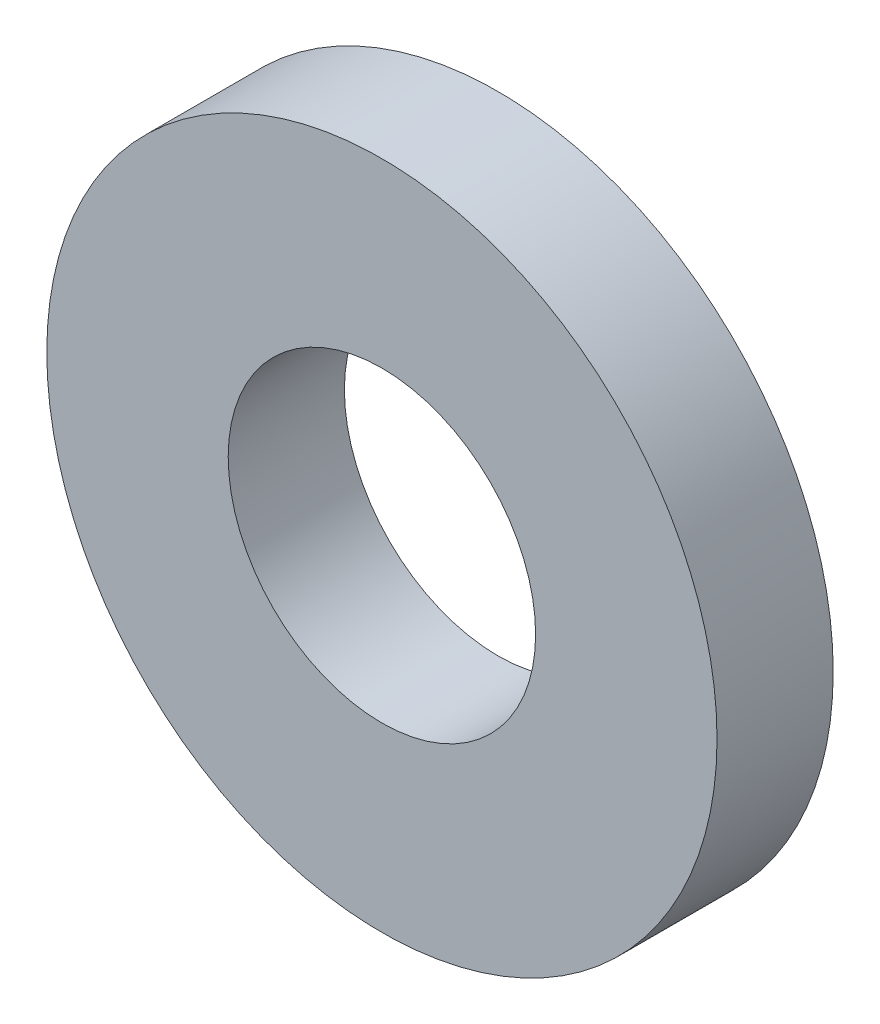
ISO-10303-21;
HEADER;
FILE_DESCRIPTION(('STEP AP214'),'2;1');
FILE_NAME('part.step','',(''),(''),'','','');
FILE_SCHEMA(('AUTOMOTIVE_DESIGN { 1 0 10303 214 1 1 1 1 }'));
ENDSEC;
DATA;
#1=APPLICATION_CONTEXT('core data for automotive mechanical design processes');
#2=APPLICATION_PROTOCOL_DEFINITION('international standard','automotive_design',2000,#1);
#3=PRODUCT_CONTEXT('',#1,'mechanical');
#4=PRODUCT('Part','Part','',(#3));
#5=PRODUCT_RELATED_PRODUCT_CATEGORY('part','',(#4));
#6=PRODUCT_DEFINITION_FORMATION('','',#4);
#7=PRODUCT_DEFINITION_CONTEXT('part definition',#1,'design');
#8=PRODUCT_DEFINITION('design','',#6,#7);
#9=PRODUCT_DEFINITION_SHAPE('','',#8);
#10=(LENGTH_UNIT() NAMED_UNIT(*) SI_UNIT(.MILLI.,.METRE.));
#11=(NAMED_UNIT(*) PLANE_ANGLE_UNIT() SI_UNIT($,.RADIAN.));
#12=(NAMED_UNIT(*) SI_UNIT($,.STERADIAN.) SOLID_ANGLE_UNIT());
#13=UNCERTAINTY_MEASURE_WITH_UNIT(LENGTH_MEASURE(1.E-05),#10,'distance_accuracy_value','');
#14=(GEOMETRIC_REPRESENTATION_CONTEXT(3) GLOBAL_UNCERTAINTY_ASSIGNED_CONTEXT((#13)) GLOBAL_UNIT_ASSIGNED_CONTEXT((#10,
#11,#12)) REPRESENTATION_CONTEXT('',''));
#15=CARTESIAN_POINT('',(0.,0.,0.));
#16=DIRECTION('',(0.,0.,1.));
#17=DIRECTION('',(1.,0.,0.));
#18=AXIS2_PLACEMENT_3D('',#15,#16,#17);
#19=CARTESIAN_POINT('',(0.,0.,1.651));
#20=DIRECTION('',(0.,0.,1.));
#21=DIRECTION('',(1.,0.,0.));
#22=AXIS2_PLACEMENT_3D('',#19,#20,#21);
#23=PLANE('',#22);
#24=CARTESIAN_POINT('',(0.,0.,1.651));
#25=DIRECTION('',(0.,0.,1.));
#26=DIRECTION('',(1.,0.,0.));
#27=AXIS2_PLACEMENT_3D('',#24,#25,#26);
#28=CIRCLE('',#27,4.7625);
#29=CARTESIAN_POINT('',(-4.7625,0.,1.651));
#30=VERTEX_POINT('',#29);
#31=EDGE_CURVE('E10',#30,#30,#28,.T.);
#32=ORIENTED_EDGE('',*,*,#31,.T.);
#33=EDGE_LOOP('',(#32));
#34=FACE_BOUND('',#33,.T.);
#35=CARTESIAN_POINT('',(0.,0.,1.651));
#36=DIRECTION('',(0.,0.,1.));
#37=DIRECTION('',(1.,0.,0.));
#38=AXIS2_PLACEMENT_3D('',#35,#36,#37);
#39=CIRCLE('',#38,2.1844);
#40=CARTESIAN_POINT('',(-2.1844,0.,1.651));
#41=VERTEX_POINT('',#40);
#42=EDGE_CURVE('E40',#41,#41,#39,.T.);
#43=ORIENTED_EDGE('',*,*,#42,.F.);
#44=EDGE_LOOP('',(#43));
#45=FACE_BOUND('',#44,.T.);
#46=ADVANCED_FACE('F29',(#34,#45),#23,.T.);
#47=CARTESIAN_POINT('',(0.,0.,0.));
#48=DIRECTION('',(0.,0.,1.));
#49=DIRECTION('',(1.,0.,0.));
#50=AXIS2_PLACEMENT_3D('',#47,#48,#49);
#51=PLANE('',#50);
#52=CARTESIAN_POINT('',(0.,0.,0.));
#53=DIRECTION('',(0.,0.,1.));
#54=DIRECTION('',(1.,0.,0.));
#55=AXIS2_PLACEMENT_3D('',#52,#53,#54);
#56=CIRCLE('',#55,4.7625);
#57=CARTESIAN_POINT('',(-4.7625,0.,0.));
#58=VERTEX_POINT('',#57);
#59=EDGE_CURVE('E33',#58,#58,#56,.T.);
#60=ORIENTED_EDGE('',*,*,#59,.F.);
#61=EDGE_LOOP('',(#60));
#62=FACE_BOUND('',#61,.T.);
#63=CARTESIAN_POINT('',(0.,0.,0.));
#64=DIRECTION('',(0.,0.,1.));
#65=DIRECTION('',(1.,0.,0.));
#66=AXIS2_PLACEMENT_3D('',#63,#64,#65);
#67=CIRCLE('',#66,2.1844);
#68=CARTESIAN_POINT('',(-2.1844,0.,0.));
#69=VERTEX_POINT('',#68);
#70=EDGE_CURVE('E42',#69,#69,#67,.T.);
#71=ORIENTED_EDGE('',*,*,#70,.T.);
#72=EDGE_LOOP('',(#71));
#73=FACE_BOUND('',#72,.T.);
#74=ADVANCED_FACE('F52',(#62,#73),#51,.F.);
#75=CARTESIAN_POINT('',(0.,0.,1.651));
#76=DIRECTION('',(0.,0.,-1.));
#77=DIRECTION('',(-1.,0.,0.));
#78=AXIS2_PLACEMENT_3D('',#75,#76,#77);
#79=CYLINDRICAL_SURFACE('',#78,4.7625);
#80=CARTESIAN_POINT('',(-4.7625,0.,1.651));
#81=CARTESIAN_POINT('',(-4.7625,0.,1.63380208333333));
#82=CARTESIAN_POINT('',(-4.7625,0.,1.61660416666667));
#83=CARTESIAN_POINT('',(-4.7625,0.,1.58220833333333));
#84=CARTESIAN_POINT('',(-4.7625,0.,1.56501041666667));
#85=CARTESIAN_POINT('',(-4.7625,0.,1.53061458333333));
#86=CARTESIAN_POINT('',(-4.7625,0.,1.51341666666667));
#87=CARTESIAN_POINT('',(-4.7625,0.,1.47902083333333));
#88=CARTESIAN_POINT('',(-4.7625,0.,1.46182291666667));
#89=CARTESIAN_POINT('',(-4.7625,0.,1.42742708333333));
#90=CARTESIAN_POINT('',(-4.7625,0.,1.41022916666667));
#91=CARTESIAN_POINT('',(-4.7625,0.,1.37583333333333));
#92=CARTESIAN_POINT('',(-4.7625,0.,1.35863541666667));
#93=CARTESIAN_POINT('',(-4.7625,0.,1.32423958333333));
#94=CARTESIAN_POINT('',(-4.7625,0.,1.30704166666667));
#95=CARTESIAN_POINT('',(-4.7625,0.,1.27264583333333));
#96=CARTESIAN_POINT('',(-4.7625,0.,1.25544791666667));
#97=CARTESIAN_POINT('',(-4.7625,0.,1.22105208333333));
#98=CARTESIAN_POINT('',(-4.7625,0.,1.20385416666667));
#99=CARTESIAN_POINT('',(-4.7625,0.,1.16945833333333));
#100=CARTESIAN_POINT('',(-4.7625,0.,1.15226041666667));
#101=CARTESIAN_POINT('',(-4.7625,0.,1.11786458333333));
#102=CARTESIAN_POINT('',(-4.7625,0.,1.10066666666667));
#103=CARTESIAN_POINT('',(-4.7625,0.,1.06627083333333));
#104=CARTESIAN_POINT('',(-4.7625,0.,1.04907291666667));
#105=CARTESIAN_POINT('',(-4.7625,0.,1.01467708333333));
#106=CARTESIAN_POINT('',(-4.7625,0.,0.997479166666666));
#107=CARTESIAN_POINT('',(-4.7625,0.,0.963083333333333));
#108=CARTESIAN_POINT('',(-4.7625,0.,0.945885416666666));
#109=CARTESIAN_POINT('',(-4.7625,0.,0.911489583333333));
#110=CARTESIAN_POINT('',(-4.7625,0.,0.894291666666666));
#111=CARTESIAN_POINT('',(-4.7625,0.,0.859895833333333));
#112=CARTESIAN_POINT('',(-4.7625,0.,0.842697916666666));
#113=CARTESIAN_POINT('',(-4.7625,0.,0.808302083333333));
#114=CARTESIAN_POINT('',(-4.7625,0.,0.791104166666666));
#115=CARTESIAN_POINT('',(-4.7625,0.,0.756708333333333));
#116=CARTESIAN_POINT('',(-4.7625,0.,0.739510416666667));
#117=CARTESIAN_POINT('',(-4.7625,0.,0.705114583333333));
#118=CARTESIAN_POINT('',(-4.7625,0.,0.687916666666667));
#119=CARTESIAN_POINT('',(-4.7625,0.,0.653520833333333));
#120=CARTESIAN_POINT('',(-4.7625,0.,0.636322916666667));
#121=CARTESIAN_POINT('',(-4.7625,0.,0.601927083333333));
#122=CARTESIAN_POINT('',(-4.7625,0.,0.584729166666667));
#123=CARTESIAN_POINT('',(-4.7625,0.,0.550333333333333));
#124=CARTESIAN_POINT('',(-4.7625,0.,0.533135416666667));
#125=CARTESIAN_POINT('',(-4.7625,0.,0.498739583333333));
#126=CARTESIAN_POINT('',(-4.7625,0.,0.481541666666667));
#127=CARTESIAN_POINT('',(-4.7625,0.,0.447145833333333));
#128=CARTESIAN_POINT('',(-4.7625,0.,0.429947916666667));
#129=CARTESIAN_POINT('',(-4.7625,0.,0.395552083333333));
#130=CARTESIAN_POINT('',(-4.7625,0.,0.378354166666667));
#131=CARTESIAN_POINT('',(-4.7625,0.,0.343958333333333));
#132=CARTESIAN_POINT('',(-4.7625,0.,0.326760416666667));
#133=CARTESIAN_POINT('',(-4.7625,0.,0.292364583333333));
#134=CARTESIAN_POINT('',(-4.7625,0.,0.275166666666667));
#135=CARTESIAN_POINT('',(-4.7625,0.,0.240770833333333));
#136=CARTESIAN_POINT('',(-4.7625,0.,0.223572916666667));
#137=CARTESIAN_POINT('',(-4.7625,0.,0.189177083333333));
#138=CARTESIAN_POINT('',(-4.7625,0.,0.171979166666667));
#139=CARTESIAN_POINT('',(-4.7625,0.,0.137583333333333));
#140=CARTESIAN_POINT('',(-4.7625,0.,0.120385416666667));
#141=CARTESIAN_POINT('',(-4.7625,0.,0.0859895833333333));
#142=CARTESIAN_POINT('',(-4.7625,0.,0.0687916666666667));
#143=CARTESIAN_POINT('',(-4.7625,0.,0.0343958333333333));
#144=CARTESIAN_POINT('',(-4.7625,0.,0.0171979166666666));
#145=CARTESIAN_POINT('',(-4.7625,0.,0.));
#146=B_SPLINE_CURVE_WITH_KNOTS('',3,(#80,#81,#82,#83,#84,#85,#86,#87,#88,#89,#90,#91,#92,#93,
#94,#95,#96,#97,#98,#99,#100,#101,#102,#103,#104,#105,#106,#107,#108,#109,#110,#111,#112,#113,
#114,#115,#116,#117,#118,#119,#120,#121,#122,#123,#124,#125,#126,#127,#128,#129,#130,#131,#132,
#133,#134,#135,#136,#137,#138,#139,#140,#141,#142,#143,#144,#145),.UNSPECIFIED.,.F.,.F.,(4,2,2,
2,2,2,2,2,2,2,2,2,2,2,2,2,2,2,2,2,2,2,2,2,2,2,2,2,2,2,2,2,4),(0.,0.0515937500000002,0.1031875,
0.15478125,0.206375,0.25796875,0.3095625,0.36115625,0.41275,0.46434375,0.5159375,0.56753125,
0.619125,0.67071875,0.7223125,0.77390625,0.8255,0.87709375,0.9286875,0.98028125,1.031875,
1.08346875,1.1350625,1.18665625,1.23825,1.28984375,1.3414375,1.39303125,1.444625,1.49621875,
1.5478125,1.59940625,1.651),.UNSPECIFIED.);
#147=EDGE_CURVE('BSEAM31',#30,#58,#146,.T.);
#148=ORIENTED_EDGE('',*,*,#31,.F.);
#149=ORIENTED_EDGE('',*,*,#59,.T.);
#150=ORIENTED_EDGE('',*,*,#147,.T.);
#151=ORIENTED_EDGE('',*,*,#147,.F.);
#152=EDGE_LOOP('',(#148,#150,#149,#151));
#153=FACE_BOUND('',#152,.T.);
#154=ADVANCED_FACE('F31',(#153),#79,.T.);
#155=CARTESIAN_POINT('',(0.,0.,1.651));
#156=DIRECTION('',(0.,0.,-1.));
#157=DIRECTION('',(-1.,0.,0.));
#158=AXIS2_PLACEMENT_3D('',#155,#156,#157);
#159=CYLINDRICAL_SURFACE('',#158,2.1844);
#160=CARTESIAN_POINT('',(-2.1844,0.,1.651));
#161=CARTESIAN_POINT('',(-2.1844,0.,1.63380208333333));
#162=CARTESIAN_POINT('',(-2.1844,0.,1.61660416666667));
#163=CARTESIAN_POINT('',(-2.1844,0.,1.58220833333333));
#164=CARTESIAN_POINT('',(-2.1844,0.,1.56501041666667));
#165=CARTESIAN_POINT('',(-2.1844,0.,1.53061458333333));
#166=CARTESIAN_POINT('',(-2.1844,0.,1.51341666666667));
#167=CARTESIAN_POINT('',(-2.1844,0.,1.47902083333333));
#168=CARTESIAN_POINT('',(-2.1844,0.,1.46182291666667));
#169=CARTESIAN_POINT('',(-2.1844,0.,1.42742708333333));
#170=CARTESIAN_POINT('',(-2.1844,0.,1.41022916666667));
#171=CARTESIAN_POINT('',(-2.1844,0.,1.37583333333333));
#172=CARTESIAN_POINT('',(-2.1844,0.,1.35863541666667));
#173=CARTESIAN_POINT('',(-2.1844,0.,1.32423958333333));
#174=CARTESIAN_POINT('',(-2.1844,0.,1.30704166666667));
#175=CARTESIAN_POINT('',(-2.1844,0.,1.27264583333333));
#176=CARTESIAN_POINT('',(-2.1844,0.,1.25544791666667));
#177=CARTESIAN_POINT('',(-2.1844,0.,1.22105208333333));
#178=CARTESIAN_POINT('',(-2.1844,0.,1.20385416666667));
#179=CARTESIAN_POINT('',(-2.1844,0.,1.16945833333333));
#180=CARTESIAN_POINT('',(-2.1844,0.,1.15226041666667));
#181=CARTESIAN_POINT('',(-2.1844,0.,1.11786458333333));
#182=CARTESIAN_POINT('',(-2.1844,0.,1.10066666666667));
#183=CARTESIAN_POINT('',(-2.1844,0.,1.06627083333333));
#184=CARTESIAN_POINT('',(-2.1844,0.,1.04907291666667));
#185=CARTESIAN_POINT('',(-2.1844,0.,1.01467708333333));
#186=CARTESIAN_POINT('',(-2.1844,0.,0.997479166666666));
#187=CARTESIAN_POINT('',(-2.1844,0.,0.963083333333333));
#188=CARTESIAN_POINT('',(-2.1844,0.,0.945885416666667));
#189=CARTESIAN_POINT('',(-2.1844,0.,0.911489583333333));
#190=CARTESIAN_POINT('',(-2.1844,0.,0.894291666666667));
#191=CARTESIAN_POINT('',(-2.1844,0.,0.859895833333333));
#192=CARTESIAN_POINT('',(-2.1844,0.,0.842697916666667));
#193=CARTESIAN_POINT('',(-2.1844,0.,0.808302083333333));
#194=CARTESIAN_POINT('',(-2.1844,0.,0.791104166666667));
#195=CARTESIAN_POINT('',(-2.1844,0.,0.756708333333333));
#196=CARTESIAN_POINT('',(-2.1844,0.,0.739510416666667));
#197=CARTESIAN_POINT('',(-2.1844,0.,0.705114583333333));
#198=CARTESIAN_POINT('',(-2.1844,0.,0.687916666666667));
#199=CARTESIAN_POINT('',(-2.1844,0.,0.653520833333333));
#200=CARTESIAN_POINT('',(-2.1844,0.,0.636322916666667));
#201=CARTESIAN_POINT('',(-2.1844,0.,0.601927083333333));
#202=CARTESIAN_POINT('',(-2.1844,0.,0.584729166666667));
#203=CARTESIAN_POINT('',(-2.1844,0.,0.550333333333333));
#204=CARTESIAN_POINT('',(-2.1844,0.,0.533135416666667));
#205=CARTESIAN_POINT('',(-2.1844,0.,0.498739583333333));
#206=CARTESIAN_POINT('',(-2.1844,0.,0.481541666666667));
#207=CARTESIAN_POINT('',(-2.1844,0.,0.447145833333333));
#208=CARTESIAN_POINT('',(-2.1844,0.,0.429947916666667));
#209=CARTESIAN_POINT('',(-2.1844,0.,0.395552083333333));
#210=CARTESIAN_POINT('',(-2.1844,0.,0.378354166666667));
#211=CARTESIAN_POINT('',(-2.1844,0.,0.343958333333333));
#212=CARTESIAN_POINT('',(-2.1844,0.,0.326760416666667));
#213=CARTESIAN_POINT('',(-2.1844,0.,0.292364583333333));
#214=CARTESIAN_POINT('',(-2.1844,0.,0.275166666666667));
#215=CARTESIAN_POINT('',(-2.1844,0.,0.240770833333333));
#216=CARTESIAN_POINT('',(-2.1844,0.,0.223572916666667));
#217=CARTESIAN_POINT('',(-2.1844,0.,0.189177083333333));
#218=CARTESIAN_POINT('',(-2.1844,0.,0.171979166666667));
#219=CARTESIAN_POINT('',(-2.1844,0.,0.137583333333333));
#220=CARTESIAN_POINT('',(-2.1844,0.,0.120385416666667));
#221=CARTESIAN_POINT('',(-2.1844,0.,0.0859895833333333));
#222=CARTESIAN_POINT('',(-2.1844,0.,0.0687916666666667));
#223=CARTESIAN_POINT('',(-2.1844,0.,0.0343958333333333));
#224=CARTESIAN_POINT('',(-2.1844,0.,0.0171979166666666));
#225=CARTESIAN_POINT('',(-2.1844,0.,0.));
#226=B_SPLINE_CURVE_WITH_KNOTS('',3,(#160,#161,#162,#163,#164,#165,#166,#167,#168,#169,#170,
#171,#172,#173,#174,#175,#176,#177,#178,#179,#180,#181,#182,#183,#184,#185,#186,#187,#188,#189,
#190,#191,#192,#193,#194,#195,#196,#197,#198,#199,#200,#201,#202,#203,#204,#205,#206,#207,#208,
#209,#210,#211,#212,#213,#214,#215,#216,#217,#218,#219,#220,#221,#222,#223,#224,#225),
.UNSPECIFIED.,.F.,.F.,(4,2,2,2,2,2,2,2,2,2,2,2,2,2,2,2,2,2,2,2,2,2,2,2,2,2,2,2,2,2,2,2,4),(0.,
0.05159375,0.1031875,0.15478125,0.206375,0.25796875,0.3095625,0.36115625,0.41275,0.46434375,
0.5159375,0.56753125,0.619125,0.67071875,0.7223125,0.77390625,0.8255,0.87709375,0.9286875,
0.98028125,1.031875,1.08346875,1.1350625,1.18665625,1.23825,1.28984375,1.3414375,1.39303125,
1.444625,1.49621875,1.5478125,1.59940625,1.651),.UNSPECIFIED.);
#227=EDGE_CURVE('BSEAM48',#41,#69,#226,.T.);
#228=ORIENTED_EDGE('',*,*,#42,.T.);
#229=ORIENTED_EDGE('',*,*,#70,.F.);
#230=ORIENTED_EDGE('',*,*,#227,.T.);
#231=ORIENTED_EDGE('',*,*,#227,.F.);
#232=EDGE_LOOP('',(#228,#230,#229,#231));
#233=FACE_BOUND('',#232,.T.);
#234=ADVANCED_FACE('F48',(#233),#159,.F.);
#235=CLOSED_SHELL('',(#46,#74,#154,#234));
#236=MANIFOLD_SOLID_BREP('B2',#235);
#237=ADVANCED_BREP_SHAPE_REPRESENTATION('',(#18,#236),#14);
#238=SHAPE_DEFINITION_REPRESENTATION(#9,#237);
ENDSEC;
END-ISO-10303-21;
